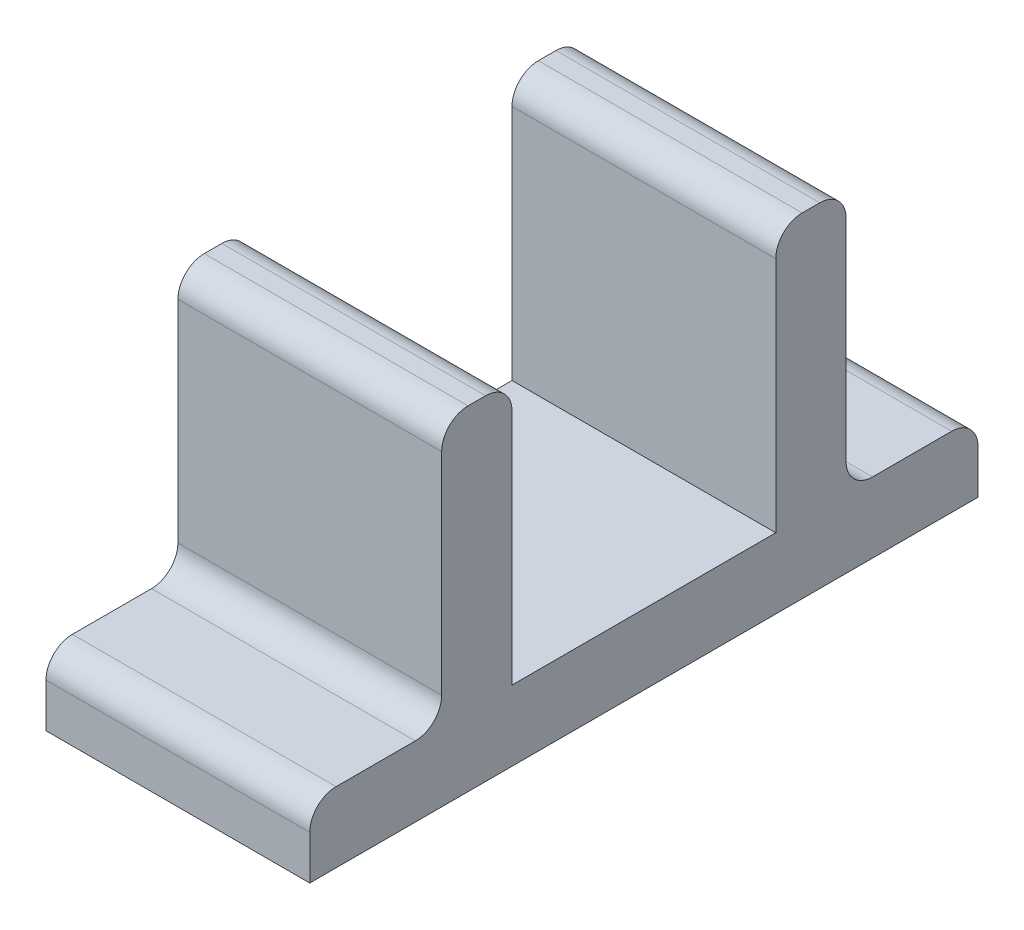
ISO-10303-21;
HEADER;
FILE_DESCRIPTION(('STEP AP214'),'2;1');
FILE_NAME('part.step','',(''),(''),'','','');
FILE_SCHEMA(('AUTOMOTIVE_DESIGN { 1 0 10303 214 1 1 1 1 }'));
ENDSEC;
DATA;
#1=APPLICATION_CONTEXT('core data for automotive mechanical design processes');
#2=APPLICATION_PROTOCOL_DEFINITION('international standard','automotive_design',2000,#1);
#3=PRODUCT_CONTEXT('',#1,'mechanical');
#4=PRODUCT('Part','Part','',(#3));
#5=PRODUCT_RELATED_PRODUCT_CATEGORY('part','',(#4));
#6=PRODUCT_DEFINITION_FORMATION('','',#4);
#7=PRODUCT_DEFINITION_CONTEXT('part definition',#1,'design');
#8=PRODUCT_DEFINITION('design','',#6,#7);
#9=PRODUCT_DEFINITION_SHAPE('','',#8);
#10=(LENGTH_UNIT() NAMED_UNIT(*) SI_UNIT(.MILLI.,.METRE.));
#11=(NAMED_UNIT(*) PLANE_ANGLE_UNIT() SI_UNIT($,.RADIAN.));
#12=(NAMED_UNIT(*) SI_UNIT($,.STERADIAN.) SOLID_ANGLE_UNIT());
#13=UNCERTAINTY_MEASURE_WITH_UNIT(LENGTH_MEASURE(1.E-05),#10,'distance_accuracy_value','');
#14=(GEOMETRIC_REPRESENTATION_CONTEXT(3) GLOBAL_UNCERTAINTY_ASSIGNED_CONTEXT((#13)) GLOBAL_UNIT_ASSIGNED_CONTEXT((#10,
#11,#12)) REPRESENTATION_CONTEXT('',''));
#15=CARTESIAN_POINT('',(0.,0.,0.));
#16=DIRECTION('',(0.,0.,1.));
#17=DIRECTION('',(1.,0.,0.));
#18=AXIS2_PLACEMENT_3D('',#15,#16,#17);
#19=CARTESIAN_POINT('',(30.,0.,-61.));
#20=DIRECTION('',(0.,0.,-1.));
#21=DIRECTION('',(-1.,0.,0.));
#22=AXIS2_PLACEMENT_3D('',#19,#20,#21);
#23=PLANE('',#22);
#24=DIRECTION('',(0.,-1.,0.));
#25=VECTOR('',#24,1.);
#26=CARTESIAN_POINT('',(0.,0.,-61.));
#27=LINE('',#26,#25);
#28=CARTESIAN_POINT('',(0.,5.00000000000001,-61.));
#29=VERTEX_POINT('',#28);
#30=CARTESIAN_POINT('',(0.,0.,-61.));
#31=VERTEX_POINT('',#30);
#32=EDGE_CURVE('E218',#29,#31,#27,.T.);
#33=ORIENTED_EDGE('',*,*,#32,.F.);
#34=DIRECTION('',(-1.,0.,0.));
#35=VECTOR('',#34,1.);
#36=CARTESIAN_POINT('',(30.,5.00000000000001,-61.));
#37=LINE('',#36,#35);
#38=CARTESIAN_POINT('',(30.,5.00000000000001,-61.));
#39=VERTEX_POINT('',#38);
#40=EDGE_CURVE('E295',#29,#39,#37,.F.);
#41=ORIENTED_EDGE('',*,*,#40,.T.);
#42=DIRECTION('',(0.,-1.,0.));
#43=VECTOR('',#42,1.);
#44=CARTESIAN_POINT('',(30.,0.,-61.));
#45=LINE('',#44,#43);
#46=CARTESIAN_POINT('',(30.,0.,-61.));
#47=VERTEX_POINT('',#46);
#48=EDGE_CURVE('E249',#39,#47,#45,.T.);
#49=ORIENTED_EDGE('',*,*,#48,.T.);
#50=DIRECTION('',(-1.,0.,0.));
#51=VECTOR('',#50,1.);
#52=CARTESIAN_POINT('',(30.,0.,-61.));
#53=LINE('',#52,#51);
#54=EDGE_CURVE('E217',#47,#31,#53,.T.);
#55=ORIENTED_EDGE('',*,*,#54,.T.);
#56=EDGE_LOOP('',(#33,#41,#49,#55));
#57=FACE_BOUND('',#56,.T.);
#58=ADVANCED_FACE('F35',(#57),#23,.T.);
#59=CARTESIAN_POINT('',(30.,8.00000000000001,0.));
#60=DIRECTION('',(0.,1.,0.));
#61=DIRECTION('',(0.,0.,1.));
#62=AXIS2_PLACEMENT_3D('',#59,#60,#61);
#63=PLANE('',#62);
#64=DIRECTION('',(0.,0.,-1.));
#65=VECTOR('',#64,1.);
#66=CARTESIAN_POINT('',(30.,8.00000000000001,0.));
#67=LINE('',#66,#65);
#68=CARTESIAN_POINT('',(30.,8.00000000000001,-49.));
#69=VERTEX_POINT('',#68);
#70=CARTESIAN_POINT('',(30.,8.00000000000001,-58.));
#71=VERTEX_POINT('',#70);
#72=EDGE_CURVE('E349',#69,#71,#67,.T.);
#73=ORIENTED_EDGE('',*,*,#72,.T.);
#74=DIRECTION('',(-1.,0.,0.));
#75=VECTOR('',#74,1.);
#76=CARTESIAN_POINT('',(30.,8.00000000000001,-58.));
#77=LINE('',#76,#75);
#78=CARTESIAN_POINT('',(0.,8.00000000000001,-58.));
#79=VERTEX_POINT('',#78);
#80=EDGE_CURVE('E292',#71,#79,#77,.T.);
#81=ORIENTED_EDGE('',*,*,#80,.T.);
#82=DIRECTION('',(0.,0.,-1.));
#83=VECTOR('',#82,1.);
#84=CARTESIAN_POINT('',(0.,8.00000000000001,0.));
#85=LINE('',#84,#83);
#86=CARTESIAN_POINT('',(0.,8.00000000000001,-49.));
#87=VERTEX_POINT('',#86);
#88=EDGE_CURVE('E220',#87,#79,#85,.T.);
#89=ORIENTED_EDGE('',*,*,#88,.F.);
#90=DIRECTION('',(-1.,0.,0.));
#91=VECTOR('',#90,1.);
#92=CARTESIAN_POINT('',(30.,8.00000000000001,-49.));
#93=LINE('',#92,#91);
#94=EDGE_CURVE('E290',#87,#69,#93,.F.);
#95=ORIENTED_EDGE('',*,*,#94,.T.);
#96=EDGE_LOOP('',(#73,#81,#89,#95));
#97=FACE_BOUND('',#96,.T.);
#98=ADVANCED_FACE('F357',(#97),#63,.T.);
#99=CARTESIAN_POINT('',(30.,0.,-46.));
#100=DIRECTION('',(0.,0.,1.));
#101=DIRECTION('',(0.,-1.,0.));
#102=AXIS2_PLACEMENT_3D('',#99,#100,#101);
#103=PLANE('',#102);
#104=DIRECTION('',(0.,1.,0.));
#105=VECTOR('',#104,1.);
#106=CARTESIAN_POINT('',(30.,0.,-46.));
#107=LINE('',#106,#105);
#108=CARTESIAN_POINT('',(30.,11.,-46.));
#109=VERTEX_POINT('',#108);
#110=CARTESIAN_POINT('',(30.,35.,-46.));
#111=VERTEX_POINT('',#110);
#112=EDGE_CURVE('E369',#109,#111,#107,.T.);
#113=ORIENTED_EDGE('',*,*,#112,.F.);
#114=DIRECTION('',(-1.,0.,0.));
#115=VECTOR('',#114,1.);
#116=CARTESIAN_POINT('',(30.,11.,-46.));
#117=LINE('',#116,#115);
#118=CARTESIAN_POINT('',(0.,11.,-46.));
#119=VERTEX_POINT('',#118);
#120=EDGE_CURVE('E299',#109,#119,#117,.T.);
#121=ORIENTED_EDGE('',*,*,#120,.T.);
#122=DIRECTION('',(0.,1.,0.));
#123=VECTOR('',#122,1.);
#124=CARTESIAN_POINT('',(0.,0.,-46.));
#125=LINE('',#124,#123);
#126=CARTESIAN_POINT('',(0.,35.,-46.));
#127=VERTEX_POINT('',#126);
#128=EDGE_CURVE('E223',#119,#127,#125,.T.);
#129=ORIENTED_EDGE('',*,*,#128,.T.);
#130=DIRECTION('',(-1.,0.,0.));
#131=VECTOR('',#130,1.);
#132=CARTESIAN_POINT('',(30.,35.,-46.));
#133=LINE('',#132,#131);
#134=EDGE_CURVE('E297',#127,#111,#133,.F.);
#135=ORIENTED_EDGE('',*,*,#134,.T.);
#136=EDGE_LOOP('',(#113,#121,#129,#135));
#137=FACE_BOUND('',#136,.T.);
#138=ADVANCED_FACE('F366',(#137),#103,.F.);
#139=CARTESIAN_POINT('',(30.,38.,0.));
#140=DIRECTION('',(0.,1.,0.));
#141=DIRECTION('',(0.,0.,1.));
#142=AXIS2_PLACEMENT_3D('',#139,#140,#141);
#143=PLANE('',#142);
#144=DIRECTION('',(0.,0.,-1.));
#145=VECTOR('',#144,1.);
#146=CARTESIAN_POINT('',(0.,38.,0.));
#147=LINE('',#146,#145);
#148=CARTESIAN_POINT('',(0.,38.,-41.));
#149=VERTEX_POINT('',#148);
#150=CARTESIAN_POINT('',(0.,38.,-43.));
#151=VERTEX_POINT('',#150);
#152=EDGE_CURVE('E226',#149,#151,#147,.T.);
#153=ORIENTED_EDGE('',*,*,#152,.F.);
#154=DIRECTION('',(-1.,0.,0.));
#155=VECTOR('',#154,1.);
#156=CARTESIAN_POINT('',(30.,38.,-41.));
#157=LINE('',#156,#155);
#158=CARTESIAN_POINT('',(30.,38.,-41.));
#159=VERTEX_POINT('',#158);
#160=EDGE_CURVE('E271',#149,#159,#157,.F.);
#161=ORIENTED_EDGE('',*,*,#160,.T.);
#162=DIRECTION('',(0.,0.,-1.));
#163=VECTOR('',#162,1.);
#164=CARTESIAN_POINT('',(30.,38.,0.));
#165=LINE('',#164,#163);
#166=CARTESIAN_POINT('',(30.,38.,-43.));
#167=VERTEX_POINT('',#166);
#168=EDGE_CURVE('E194',#159,#167,#165,.T.);
#169=ORIENTED_EDGE('',*,*,#168,.T.);
#170=DIRECTION('',(-1.,0.,0.));
#171=VECTOR('',#170,1.);
#172=CARTESIAN_POINT('',(0.,38.,-43.));
#173=LINE('',#172,#171);
#174=EDGE_CURVE('E268',#167,#151,#173,.T.);
#175=ORIENTED_EDGE('',*,*,#174,.T.);
#176=EDGE_LOOP('',(#153,#161,#169,#175));
#177=FACE_BOUND('',#176,.T.);
#178=ADVANCED_FACE('F377',(#177),#143,.T.);
#179=CARTESIAN_POINT('',(30.,0.,-38.));
#180=DIRECTION('',(0.,0.,1.));
#181=DIRECTION('',(1.,0.,0.));
#182=AXIS2_PLACEMENT_3D('',#179,#180,#181);
#183=PLANE('',#182);
#184=DIRECTION('',(0.,1.,0.));
#185=VECTOR('',#184,1.);
#186=CARTESIAN_POINT('',(30.,0.,-38.));
#187=LINE('',#186,#185);
#188=CARTESIAN_POINT('',(30.,8.00000000000001,-38.));
#189=VERTEX_POINT('',#188);
#190=CARTESIAN_POINT('',(30.,35.,-38.));
#191=VERTEX_POINT('',#190);
#192=EDGE_CURVE('E176',#189,#191,#187,.T.);
#193=ORIENTED_EDGE('',*,*,#192,.T.);
#194=DIRECTION('',(-1.,0.,0.));
#195=VECTOR('',#194,1.);
#196=CARTESIAN_POINT('',(30.,35.,-38.));
#197=LINE('',#196,#195);
#198=CARTESIAN_POINT('',(0.,35.,-38.));
#199=VERTEX_POINT('',#198);
#200=EDGE_CURVE('E184',#191,#199,#197,.T.);
#201=ORIENTED_EDGE('',*,*,#200,.T.);
#202=DIRECTION('',(0.,1.,0.));
#203=VECTOR('',#202,1.);
#204=CARTESIAN_POINT('',(0.,0.,-38.));
#205=LINE('',#204,#203);
#206=CARTESIAN_POINT('',(0.,8.00000000000001,-38.));
#207=VERTEX_POINT('',#206);
#208=EDGE_CURVE('E179',#207,#199,#205,.T.);
#209=ORIENTED_EDGE('',*,*,#208,.F.);
#210=DIRECTION('',(-1.,0.,0.));
#211=VECTOR('',#210,1.);
#212=CARTESIAN_POINT('',(30.,8.00000000000001,-38.));
#213=LINE('',#212,#211);
#214=EDGE_CURVE('E172',#189,#207,#213,.T.);
#215=ORIENTED_EDGE('',*,*,#214,.F.);
#216=EDGE_LOOP('',(#193,#201,#209,#215));
#217=FACE_BOUND('',#216,.T.);
#218=ADVANCED_FACE('F174',(#217),#183,.T.);
#219=CARTESIAN_POINT('',(30.,8.00000000000001,0.));
#220=DIRECTION('',(0.,1.,0.));
#221=DIRECTION('',(0.,0.,1.));
#222=AXIS2_PLACEMENT_3D('',#219,#220,#221);
#223=PLANE('',#222);
#224=DIRECTION('',(0.,0.,-1.));
#225=VECTOR('',#224,1.);
#226=CARTESIAN_POINT('',(0.,8.00000000000001,0.));
#227=LINE('',#226,#225);
#228=CARTESIAN_POINT('',(0.,8.00000000000001,-8.));
#229=VERTEX_POINT('',#228);
#230=EDGE_CURVE('E230',#229,#207,#227,.T.);
#231=ORIENTED_EDGE('',*,*,#230,.F.);
#232=DIRECTION('',(-1.,0.,0.));
#233=VECTOR('',#232,1.);
#234=CARTESIAN_POINT('',(30.,8.00000000000001,-8.));
#235=LINE('',#234,#233);
#236=CARTESIAN_POINT('',(30.,8.00000000000001,-8.));
#237=VERTEX_POINT('',#236);
#238=EDGE_CURVE('E185',#237,#229,#235,.T.);
#239=ORIENTED_EDGE('',*,*,#238,.F.);
#240=DIRECTION('',(0.,0.,-1.));
#241=VECTOR('',#240,1.);
#242=CARTESIAN_POINT('',(30.,8.00000000000001,0.));
#243=LINE('',#242,#241);
#244=EDGE_CURVE('E191',#237,#189,#243,.T.);
#245=ORIENTED_EDGE('',*,*,#244,.T.);
#246=ORIENTED_EDGE('',*,*,#214,.T.);
#247=EDGE_LOOP('',(#231,#239,#245,#246));
#248=FACE_BOUND('',#247,.T.);
#249=ADVANCED_FACE('F197',(#248),#223,.T.);
#250=CARTESIAN_POINT('',(30.,0.,-8.));
#251=DIRECTION('',(0.,0.,-1.));
#252=DIRECTION('',(0.,1.,0.));
#253=AXIS2_PLACEMENT_3D('',#250,#251,#252);
#254=PLANE('',#253);
#255=DIRECTION('',(0.,-1.,0.));
#256=VECTOR('',#255,1.);
#257=CARTESIAN_POINT('',(0.,0.,-8.));
#258=LINE('',#257,#256);
#259=CARTESIAN_POINT('',(0.,35.,-7.99999999999999));
#260=VERTEX_POINT('',#259);
#261=EDGE_CURVE('E232',#260,#229,#258,.T.);
#262=ORIENTED_EDGE('',*,*,#261,.F.);
#263=DIRECTION('',(-1.,0.,0.));
#264=VECTOR('',#263,1.);
#265=CARTESIAN_POINT('',(30.,35.,-7.99999999999999));
#266=LINE('',#265,#264);
#267=CARTESIAN_POINT('',(30.,35.,-7.99999999999999));
#268=VERTEX_POINT('',#267);
#269=EDGE_CURVE('E288',#260,#268,#266,.F.);
#270=ORIENTED_EDGE('',*,*,#269,.T.);
#271=DIRECTION('',(0.,-1.,0.));
#272=VECTOR('',#271,1.);
#273=CARTESIAN_POINT('',(30.,0.,-8.));
#274=LINE('',#273,#272);
#275=EDGE_CURVE('E199',#268,#237,#274,.T.);
#276=ORIENTED_EDGE('',*,*,#275,.T.);
#277=ORIENTED_EDGE('',*,*,#238,.T.);
#278=EDGE_LOOP('',(#262,#270,#276,#277));
#279=FACE_BOUND('',#278,.T.);
#280=ADVANCED_FACE('F386',(#279),#254,.T.);
#281=CARTESIAN_POINT('',(30.,38.,0.));
#282=DIRECTION('',(0.,1.,0.));
#283=DIRECTION('',(0.,0.,1.));
#284=AXIS2_PLACEMENT_3D('',#281,#282,#283);
#285=PLANE('',#284);
#286=DIRECTION('',(0.,0.,-1.));
#287=VECTOR('',#286,1.);
#288=CARTESIAN_POINT('',(30.,38.,0.));
#289=LINE('',#288,#287);
#290=CARTESIAN_POINT('',(30.,38.,-2.99999999999999));
#291=VERTEX_POINT('',#290);
#292=CARTESIAN_POINT('',(30.,38.,-4.99999999999999));
#293=VERTEX_POINT('',#292);
#294=EDGE_CURVE('E201',#291,#293,#289,.T.);
#295=ORIENTED_EDGE('',*,*,#294,.T.);
#296=DIRECTION('',(-1.,0.,0.));
#297=VECTOR('',#296,1.);
#298=CARTESIAN_POINT('',(30.,38.,-4.99999999999999));
#299=LINE('',#298,#297);
#300=CARTESIAN_POINT('',(0.,38.,-4.99999999999999));
#301=VERTEX_POINT('',#300);
#302=EDGE_CURVE('E285',#293,#301,#299,.T.);
#303=ORIENTED_EDGE('',*,*,#302,.T.);
#304=DIRECTION('',(0.,0.,-1.));
#305=VECTOR('',#304,1.);
#306=CARTESIAN_POINT('',(0.,38.,0.));
#307=LINE('',#306,#305);
#308=CARTESIAN_POINT('',(0.,38.,-2.99999999999999));
#309=VERTEX_POINT('',#308);
#310=EDGE_CURVE('E234',#309,#301,#307,.T.);
#311=ORIENTED_EDGE('',*,*,#310,.F.);
#312=DIRECTION('',(-1.,0.,0.));
#313=VECTOR('',#312,1.);
#314=CARTESIAN_POINT('',(30.,38.,-2.99999999999999));
#315=LINE('',#314,#313);
#316=EDGE_CURVE('E283',#309,#291,#315,.F.);
#317=ORIENTED_EDGE('',*,*,#316,.T.);
#318=EDGE_LOOP('',(#295,#303,#311,#317));
#319=FACE_BOUND('',#318,.T.);
#320=ADVANCED_FACE('F394',(#319),#285,.T.);
#321=CARTESIAN_POINT('',(30.,0.,0.));
#322=DIRECTION('',(0.,0.,1.));
#323=DIRECTION('',(0.,-1.,0.));
#324=AXIS2_PLACEMENT_3D('',#321,#322,#323);
#325=PLANE('',#324);
#326=DIRECTION('',(0.,1.,0.));
#327=VECTOR('',#326,1.);
#328=CARTESIAN_POINT('',(0.,0.,0.));
#329=LINE('',#328,#327);
#330=CARTESIAN_POINT('',(0.,11.,0.));
#331=VERTEX_POINT('',#330);
#332=CARTESIAN_POINT('',(0.,35.,0.));
#333=VERTEX_POINT('',#332);
#334=EDGE_CURVE('E237',#331,#333,#329,.T.);
#335=ORIENTED_EDGE('',*,*,#334,.F.);
#336=DIRECTION('',(-1.,0.,0.));
#337=VECTOR('',#336,1.);
#338=CARTESIAN_POINT('',(30.,11.,0.));
#339=LINE('',#338,#337);
#340=CARTESIAN_POINT('',(30.,11.,0.));
#341=VERTEX_POINT('',#340);
#342=EDGE_CURVE('E310',#331,#341,#339,.F.);
#343=ORIENTED_EDGE('',*,*,#342,.T.);
#344=DIRECTION('',(0.,1.,0.));
#345=VECTOR('',#344,1.);
#346=CARTESIAN_POINT('',(30.,0.,0.));
#347=LINE('',#346,#345);
#348=CARTESIAN_POINT('',(30.,35.,0.));
#349=VERTEX_POINT('',#348);
#350=EDGE_CURVE('E207',#341,#349,#347,.T.);
#351=ORIENTED_EDGE('',*,*,#350,.T.);
#352=DIRECTION('',(-1.,0.,0.));
#353=VECTOR('',#352,1.);
#354=CARTESIAN_POINT('',(30.,35.,0.));
#355=LINE('',#354,#353);
#356=EDGE_CURVE('E307',#349,#333,#355,.T.);
#357=ORIENTED_EDGE('',*,*,#356,.T.);
#358=EDGE_LOOP('',(#335,#343,#351,#357));
#359=FACE_BOUND('',#358,.T.);
#360=ADVANCED_FACE('F326',(#359),#325,.T.);
#361=CARTESIAN_POINT('',(30.,8.00000000000001,0.));
#362=DIRECTION('',(0.,1.,0.));
#363=DIRECTION('',(0.,0.,1.));
#364=AXIS2_PLACEMENT_3D('',#361,#362,#363);
#365=PLANE('',#364);
#366=DIRECTION('',(0.,0.,-1.));
#367=VECTOR('',#366,1.);
#368=CARTESIAN_POINT('',(30.,8.00000000000001,0.));
#369=LINE('',#368,#367);
#370=CARTESIAN_POINT('',(30.,8.00000000000001,12.));
#371=VERTEX_POINT('',#370);
#372=CARTESIAN_POINT('',(30.,8.00000000000001,3.));
#373=VERTEX_POINT('',#372);
#374=EDGE_CURVE('E210',#371,#373,#369,.T.);
#375=ORIENTED_EDGE('',*,*,#374,.T.);
#376=DIRECTION('',(-1.,0.,0.));
#377=VECTOR('',#376,1.);
#378=CARTESIAN_POINT('',(0.,8.00000000000001,3.));
#379=LINE('',#378,#377);
#380=CARTESIAN_POINT('',(0.,8.00000000000001,3.));
#381=VERTEX_POINT('',#380);
#382=EDGE_CURVE('E304',#373,#381,#379,.T.);
#383=ORIENTED_EDGE('',*,*,#382,.T.);
#384=DIRECTION('',(0.,0.,-1.));
#385=VECTOR('',#384,1.);
#386=CARTESIAN_POINT('',(0.,8.00000000000001,0.));
#387=LINE('',#386,#385);
#388=CARTESIAN_POINT('',(0.,8.00000000000001,12.));
#389=VERTEX_POINT('',#388);
#390=EDGE_CURVE('E240',#389,#381,#387,.T.);
#391=ORIENTED_EDGE('',*,*,#390,.F.);
#392=DIRECTION('',(-1.,0.,0.));
#393=VECTOR('',#392,1.);
#394=CARTESIAN_POINT('',(30.,8.00000000000001,12.));
#395=LINE('',#394,#393);
#396=EDGE_CURVE('E302',#389,#371,#395,.F.);
#397=ORIENTED_EDGE('',*,*,#396,.T.);
#398=EDGE_LOOP('',(#375,#383,#391,#397));
#399=FACE_BOUND('',#398,.T.);
#400=ADVANCED_FACE('F330',(#399),#365,.T.);
#401=CARTESIAN_POINT('',(30.,0.,15.));
#402=DIRECTION('',(0.,0.,1.));
#403=DIRECTION('',(1.,0.,0.));
#404=AXIS2_PLACEMENT_3D('',#401,#402,#403);
#405=PLANE('',#404);
#406=DIRECTION('',(0.,1.,0.));
#407=VECTOR('',#406,1.);
#408=CARTESIAN_POINT('',(30.,0.,15.));
#409=LINE('',#408,#407);
#410=CARTESIAN_POINT('',(30.,0.,15.));
#411=VERTEX_POINT('',#410);
#412=CARTESIAN_POINT('',(30.,5.00000000000001,15.));
#413=VERTEX_POINT('',#412);
#414=EDGE_CURVE('E212',#411,#413,#409,.T.);
#415=ORIENTED_EDGE('',*,*,#414,.T.);
#416=DIRECTION('',(-1.,0.,0.));
#417=VECTOR('',#416,1.);
#418=CARTESIAN_POINT('',(30.,5.00000000000001,15.));
#419=LINE('',#418,#417);
#420=CARTESIAN_POINT('',(0.,5.00000000000001,15.));
#421=VERTEX_POINT('',#420);
#422=EDGE_CURVE('E312',#413,#421,#419,.T.);
#423=ORIENTED_EDGE('',*,*,#422,.T.);
#424=DIRECTION('',(0.,1.,0.));
#425=VECTOR('',#424,1.);
#426=CARTESIAN_POINT('',(0.,0.,15.));
#427=LINE('',#426,#425);
#428=CARTESIAN_POINT('',(0.,0.,15.));
#429=VERTEX_POINT('',#428);
#430=EDGE_CURVE('E243',#429,#421,#427,.T.);
#431=ORIENTED_EDGE('',*,*,#430,.F.);
#432=DIRECTION('',(-1.,0.,0.));
#433=VECTOR('',#432,1.);
#434=CARTESIAN_POINT('',(30.,0.,15.));
#435=LINE('',#434,#433);
#436=EDGE_CURVE('E252',#411,#429,#435,.T.);
#437=ORIENTED_EDGE('',*,*,#436,.F.);
#438=EDGE_LOOP('',(#415,#423,#431,#437));
#439=FACE_BOUND('',#438,.T.);
#440=ADVANCED_FACE('F337',(#439),#405,.T.);
#441=CARTESIAN_POINT('',(30.,0.,0.));
#442=DIRECTION('',(0.,1.,0.));
#443=DIRECTION('',(0.,0.,1.));
#444=AXIS2_PLACEMENT_3D('',#441,#442,#443);
#445=PLANE('',#444);
#446=DIRECTION('',(0.,0.,-1.));
#447=VECTOR('',#446,1.);
#448=CARTESIAN_POINT('',(0.,0.,0.));
#449=LINE('',#448,#447);
#450=EDGE_CURVE('E246',#429,#31,#449,.T.);
#451=ORIENTED_EDGE('',*,*,#450,.T.);
#452=ORIENTED_EDGE('',*,*,#54,.F.);
#453=DIRECTION('',(0.,0.,-1.));
#454=VECTOR('',#453,1.);
#455=CARTESIAN_POINT('',(30.,0.,0.));
#456=LINE('',#455,#454);
#457=EDGE_CURVE('E214',#411,#47,#456,.T.);
#458=ORIENTED_EDGE('',*,*,#457,.F.);
#459=ORIENTED_EDGE('',*,*,#436,.T.);
#460=EDGE_LOOP('',(#451,#452,#458,#459));
#461=FACE_BOUND('',#460,.T.);
#462=ADVANCED_FACE('F342',(#461),#445,.F.);
#463=CARTESIAN_POINT('',(30.,0.,0.));
#464=DIRECTION('',(1.,0.,0.));
#465=DIRECTION('',(0.,0.,-1.));
#466=AXIS2_PLACEMENT_3D('',#463,#464,#465);
#467=PLANE('',#466);
#468=ORIENTED_EDGE('',*,*,#168,.F.);
#469=CARTESIAN_POINT('',(30.,35.,-41.));
#470=DIRECTION('',(1.,0.,0.));
#471=DIRECTION('',(0.,0.,-1.));
#472=AXIS2_PLACEMENT_3D('',#469,#470,#471);
#473=CIRCLE('',#472,3.);
#474=EDGE_CURVE('E193',#159,#191,#473,.T.);
#475=ORIENTED_EDGE('',*,*,#474,.T.);
#476=ORIENTED_EDGE('',*,*,#192,.F.);
#477=ORIENTED_EDGE('',*,*,#244,.F.);
#478=ORIENTED_EDGE('',*,*,#275,.F.);
#479=CARTESIAN_POINT('',(30.,35.,-4.99999999999999));
#480=DIRECTION('',(1.,0.,0.));
#481=DIRECTION('',(0.,0.,-1.));
#482=AXIS2_PLACEMENT_3D('',#479,#480,#481);
#483=CIRCLE('',#482,3.);
#484=EDGE_CURVE('E280',#268,#293,#483,.T.);
#485=ORIENTED_EDGE('',*,*,#484,.T.);
#486=ORIENTED_EDGE('',*,*,#294,.F.);
#487=CARTESIAN_POINT('',(30.,35.,-2.99999999999999));
#488=DIRECTION('',(1.,0.,0.));
#489=DIRECTION('',(0.,0.,-1.));
#490=AXIS2_PLACEMENT_3D('',#487,#488,#489);
#491=CIRCLE('',#490,3.);
#492=EDGE_CURVE('E273',#291,#349,#491,.T.);
#493=ORIENTED_EDGE('',*,*,#492,.T.);
#494=ORIENTED_EDGE('',*,*,#350,.F.);
#495=CARTESIAN_POINT('',(30.,11.,3.));
#496=DIRECTION('',(1.,0.,0.));
#497=DIRECTION('',(0.,0.,-1.));
#498=AXIS2_PLACEMENT_3D('',#495,#496,#497);
#499=CIRCLE('',#498,3.);
#500=EDGE_CURVE('E11',#341,#373,#499,.F.);
#501=ORIENTED_EDGE('',*,*,#500,.T.);
#502=ORIENTED_EDGE('',*,*,#374,.F.);
#503=CARTESIAN_POINT('',(30.,5.00000000000001,12.));
#504=DIRECTION('',(1.,0.,0.));
#505=DIRECTION('',(0.,0.,-1.));
#506=AXIS2_PLACEMENT_3D('',#503,#504,#505);
#507=CIRCLE('',#506,3.);
#508=EDGE_CURVE('E50',#371,#413,#507,.T.);
#509=ORIENTED_EDGE('',*,*,#508,.T.);
#510=ORIENTED_EDGE('',*,*,#414,.F.);
#511=ORIENTED_EDGE('',*,*,#457,.T.);
#512=ORIENTED_EDGE('',*,*,#48,.F.);
#513=CARTESIAN_POINT('',(30.,5.00000000000001,-58.));
#514=DIRECTION('',(1.,0.,0.));
#515=DIRECTION('',(0.,0.,-1.));
#516=AXIS2_PLACEMENT_3D('',#513,#514,#515);
#517=CIRCLE('',#516,3.);
#518=EDGE_CURVE('E278',#39,#71,#517,.T.);
#519=ORIENTED_EDGE('',*,*,#518,.T.);
#520=ORIENTED_EDGE('',*,*,#72,.F.);
#521=CARTESIAN_POINT('',(30.,11.,-49.));
#522=DIRECTION('',(1.,0.,0.));
#523=DIRECTION('',(0.,0.,-1.));
#524=AXIS2_PLACEMENT_3D('',#521,#522,#523);
#525=CIRCLE('',#524,3.);
#526=EDGE_CURVE('E317',#69,#109,#525,.F.);
#527=ORIENTED_EDGE('',*,*,#526,.T.);
#528=ORIENTED_EDGE('',*,*,#112,.T.);
#529=CARTESIAN_POINT('',(30.,35.,-43.));
#530=DIRECTION('',(1.,0.,0.));
#531=DIRECTION('',(0.,0.,-1.));
#532=AXIS2_PLACEMENT_3D('',#529,#530,#531);
#533=CIRCLE('',#532,3.);
#534=EDGE_CURVE('E275',#111,#167,#533,.T.);
#535=ORIENTED_EDGE('',*,*,#534,.T.);
#536=EDGE_LOOP('',(#468,#475,#476,#477,#478,#485,#486,#493,#494,#501,#502,#509,#510,#511,#512,
#519,#520,#527,#528,#535));
#537=FACE_BOUND('',#536,.T.);
#538=ADVANCED_FACE('F189',(#537),#467,.T.);
#539=CARTESIAN_POINT('',(0.,0.,0.));
#540=DIRECTION('',(1.,0.,0.));
#541=DIRECTION('',(0.,0.,-1.));
#542=AXIS2_PLACEMENT_3D('',#539,#540,#541);
#543=PLANE('',#542);
#544=ORIENTED_EDGE('',*,*,#208,.T.);
#545=CARTESIAN_POINT('',(0.,35.,-41.));
#546=DIRECTION('',(1.,0.,0.));
#547=DIRECTION('',(0.,0.,-1.));
#548=AXIS2_PLACEMENT_3D('',#545,#546,#547);
#549=CIRCLE('',#548,3.);
#550=EDGE_CURVE('E266',#199,#149,#549,.F.);
#551=ORIENTED_EDGE('',*,*,#550,.T.);
#552=ORIENTED_EDGE('',*,*,#152,.T.);
#553=CARTESIAN_POINT('',(0.,35.,-43.));
#554=DIRECTION('',(1.,0.,0.));
#555=DIRECTION('',(0.,0.,-1.));
#556=AXIS2_PLACEMENT_3D('',#553,#554,#555);
#557=CIRCLE('',#556,3.);
#558=EDGE_CURVE('E258',#151,#127,#557,.F.);
#559=ORIENTED_EDGE('',*,*,#558,.T.);
#560=ORIENTED_EDGE('',*,*,#128,.F.);
#561=CARTESIAN_POINT('',(0.,11.,-49.));
#562=DIRECTION('',(1.,0.,0.));
#563=DIRECTION('',(0.,0.,-1.));
#564=AXIS2_PLACEMENT_3D('',#561,#562,#563);
#565=CIRCLE('',#564,3.);
#566=EDGE_CURVE('E315',#119,#87,#565,.T.);
#567=ORIENTED_EDGE('',*,*,#566,.T.);
#568=ORIENTED_EDGE('',*,*,#88,.T.);
#569=CARTESIAN_POINT('',(0.,5.00000000000001,-58.));
#570=DIRECTION('',(1.,0.,0.));
#571=DIRECTION('',(0.,0.,-1.));
#572=AXIS2_PLACEMENT_3D('',#569,#570,#571);
#573=CIRCLE('',#572,3.);
#574=EDGE_CURVE('E262',#79,#29,#573,.F.);
#575=ORIENTED_EDGE('',*,*,#574,.T.);
#576=ORIENTED_EDGE('',*,*,#32,.T.);
#577=ORIENTED_EDGE('',*,*,#450,.F.);
#578=ORIENTED_EDGE('',*,*,#430,.T.);
#579=CARTESIAN_POINT('',(0.,5.00000000000001,12.));
#580=DIRECTION('',(1.,0.,0.));
#581=DIRECTION('',(0.,0.,-1.));
#582=AXIS2_PLACEMENT_3D('',#579,#580,#581);
#583=CIRCLE('',#582,3.);
#584=EDGE_CURVE('E260',#421,#389,#583,.F.);
#585=ORIENTED_EDGE('',*,*,#584,.T.);
#586=ORIENTED_EDGE('',*,*,#390,.T.);
#587=CARTESIAN_POINT('',(0.,11.,3.));
#588=DIRECTION('',(1.,0.,0.));
#589=DIRECTION('',(0.,0.,-1.));
#590=AXIS2_PLACEMENT_3D('',#587,#588,#589);
#591=CIRCLE('',#590,3.);
#592=EDGE_CURVE('E43',#381,#331,#591,.T.);
#593=ORIENTED_EDGE('',*,*,#592,.T.);
#594=ORIENTED_EDGE('',*,*,#334,.T.);
#595=CARTESIAN_POINT('',(0.,35.,-2.99999999999999));
#596=DIRECTION('',(1.,0.,0.));
#597=DIRECTION('',(0.,0.,-1.));
#598=AXIS2_PLACEMENT_3D('',#595,#596,#597);
#599=CIRCLE('',#598,3.);
#600=EDGE_CURVE('E256',#333,#309,#599,.F.);
#601=ORIENTED_EDGE('',*,*,#600,.T.);
#602=ORIENTED_EDGE('',*,*,#310,.T.);
#603=CARTESIAN_POINT('',(0.,35.,-4.99999999999999));
#604=DIRECTION('',(1.,0.,0.));
#605=DIRECTION('',(0.,0.,-1.));
#606=AXIS2_PLACEMENT_3D('',#603,#604,#605);
#607=CIRCLE('',#606,3.);
#608=EDGE_CURVE('E264',#301,#260,#607,.F.);
#609=ORIENTED_EDGE('',*,*,#608,.T.);
#610=ORIENTED_EDGE('',*,*,#261,.T.);
#611=ORIENTED_EDGE('',*,*,#230,.T.);
#612=EDGE_LOOP('',(#544,#551,#552,#559,#560,#567,#568,#575,#576,#577,#578,#585,#586,#593,#594,
#601,#602,#609,#610,#611));
#613=FACE_BOUND('',#612,.T.);
#614=ADVANCED_FACE('F320',(#613),#543,.F.);
#615=CARTESIAN_POINT('',(30.,35.,-41.));
#616=DIRECTION('',(-1.,0.,0.));
#617=DIRECTION('',(0.,0.,1.));
#618=AXIS2_PLACEMENT_3D('',#615,#616,#617);
#619=CYLINDRICAL_SURFACE('',#618,3.);
#620=ORIENTED_EDGE('',*,*,#474,.F.);
#621=ORIENTED_EDGE('',*,*,#160,.F.);
#622=ORIENTED_EDGE('',*,*,#550,.F.);
#623=ORIENTED_EDGE('',*,*,#200,.F.);
#624=EDGE_LOOP('',(#620,#621,#622,#623));
#625=FACE_BOUND('',#624,.T.);
#626=ADVANCED_FACE('F382',(#625),#619,.T.);
#627=CARTESIAN_POINT('',(30.,35.,-4.99999999999999));
#628=DIRECTION('',(-1.,0.,0.));
#629=DIRECTION('',(0.,0.,1.));
#630=AXIS2_PLACEMENT_3D('',#627,#628,#629);
#631=CYLINDRICAL_SURFACE('',#630,3.);
#632=ORIENTED_EDGE('',*,*,#484,.F.);
#633=ORIENTED_EDGE('',*,*,#269,.F.);
#634=ORIENTED_EDGE('',*,*,#608,.F.);
#635=ORIENTED_EDGE('',*,*,#302,.F.);
#636=EDGE_LOOP('',(#632,#633,#634,#635));
#637=FACE_BOUND('',#636,.T.);
#638=ADVANCED_FACE('F391',(#637),#631,.T.);
#639=CARTESIAN_POINT('',(30.,5.00000000000001,-58.));
#640=DIRECTION('',(-1.,0.,0.));
#641=DIRECTION('',(0.,0.,1.));
#642=AXIS2_PLACEMENT_3D('',#639,#640,#641);
#643=CYLINDRICAL_SURFACE('',#642,3.);
#644=ORIENTED_EDGE('',*,*,#518,.F.);
#645=ORIENTED_EDGE('',*,*,#40,.F.);
#646=ORIENTED_EDGE('',*,*,#574,.F.);
#647=ORIENTED_EDGE('',*,*,#80,.F.);
#648=EDGE_LOOP('',(#644,#645,#646,#647));
#649=FACE_BOUND('',#648,.T.);
#650=ADVANCED_FACE('F354',(#649),#643,.T.);
#651=CARTESIAN_POINT('',(30.,11.,-49.));
#652=DIRECTION('',(-1.,0.,0.));
#653=DIRECTION('',(0.,0.,1.));
#654=AXIS2_PLACEMENT_3D('',#651,#652,#653);
#655=CYLINDRICAL_SURFACE('',#654,3.);
#656=ORIENTED_EDGE('',*,*,#526,.F.);
#657=ORIENTED_EDGE('',*,*,#94,.F.);
#658=ORIENTED_EDGE('',*,*,#566,.F.);
#659=ORIENTED_EDGE('',*,*,#120,.F.);
#660=EDGE_LOOP('',(#656,#657,#658,#659));
#661=FACE_BOUND('',#660,.T.);
#662=ADVANCED_FACE('F363',(#661),#655,.F.);
#663=CARTESIAN_POINT('',(30.,11.,3.));
#664=DIRECTION('',(1.,0.,0.));
#665=DIRECTION('',(0.,0.,-1.));
#666=AXIS2_PLACEMENT_3D('',#663,#664,#665);
#667=CYLINDRICAL_SURFACE('',#666,3.);
#668=ORIENTED_EDGE('',*,*,#500,.F.);
#669=ORIENTED_EDGE('',*,*,#342,.F.);
#670=ORIENTED_EDGE('',*,*,#592,.F.);
#671=ORIENTED_EDGE('',*,*,#382,.F.);
#672=EDGE_LOOP('',(#668,#669,#670,#671));
#673=FACE_BOUND('',#672,.T.);
#674=ADVANCED_FACE('F328',(#673),#667,.F.);
#675=CARTESIAN_POINT('',(30.,5.00000000000001,12.));
#676=DIRECTION('',(-1.,0.,0.));
#677=DIRECTION('',(0.,0.,1.));
#678=AXIS2_PLACEMENT_3D('',#675,#676,#677);
#679=CYLINDRICAL_SURFACE('',#678,3.);
#680=ORIENTED_EDGE('',*,*,#508,.F.);
#681=ORIENTED_EDGE('',*,*,#396,.F.);
#682=ORIENTED_EDGE('',*,*,#584,.F.);
#683=ORIENTED_EDGE('',*,*,#422,.F.);
#684=EDGE_LOOP('',(#680,#681,#682,#683));
#685=FACE_BOUND('',#684,.T.);
#686=ADVANCED_FACE('F334',(#685),#679,.T.);
#687=CARTESIAN_POINT('',(30.,35.,-43.));
#688=DIRECTION('',(1.,0.,0.));
#689=DIRECTION('',(0.,0.,-1.));
#690=AXIS2_PLACEMENT_3D('',#687,#688,#689);
#691=CYLINDRICAL_SURFACE('',#690,3.);
#692=ORIENTED_EDGE('',*,*,#534,.F.);
#693=ORIENTED_EDGE('',*,*,#134,.F.);
#694=ORIENTED_EDGE('',*,*,#558,.F.);
#695=ORIENTED_EDGE('',*,*,#174,.F.);
#696=EDGE_LOOP('',(#692,#693,#694,#695));
#697=FACE_BOUND('',#696,.T.);
#698=ADVANCED_FACE('F380',(#697),#691,.T.);
#699=CARTESIAN_POINT('',(30.,35.,-2.99999999999999));
#700=DIRECTION('',(-1.,0.,0.));
#701=DIRECTION('',(0.,0.,1.));
#702=AXIS2_PLACEMENT_3D('',#699,#700,#701);
#703=CYLINDRICAL_SURFACE('',#702,3.);
#704=ORIENTED_EDGE('',*,*,#492,.F.);
#705=ORIENTED_EDGE('',*,*,#316,.F.);
#706=ORIENTED_EDGE('',*,*,#600,.F.);
#707=ORIENTED_EDGE('',*,*,#356,.F.);
#708=EDGE_LOOP('',(#704,#705,#706,#707));
#709=FACE_BOUND('',#708,.T.);
#710=ADVANCED_FACE('F37',(#709),#703,.T.);
#711=CLOSED_SHELL('',(#58,#98,#138,#178,#218,#249,#280,#320,#360,#400,#440,#462,#538,#614,#626,
#638,#650,#662,#674,#686,#698,#710));
#712=MANIFOLD_SOLID_BREP('B2',#711);
#713=ADVANCED_BREP_SHAPE_REPRESENTATION('',(#18,#712),#14);
#714=SHAPE_DEFINITION_REPRESENTATION(#9,#713);
ENDSEC;
END-ISO-10303-21;
